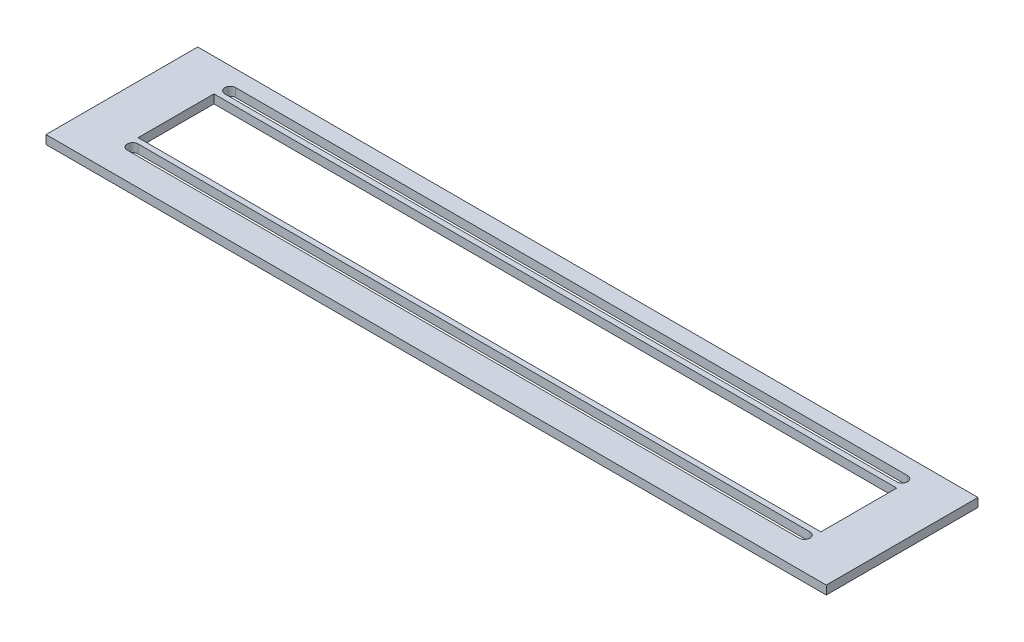
ISO-10303-21;
HEADER;
FILE_DESCRIPTION(('STEP AP214'),'2;1');
FILE_NAME('part.step','',(''),(''),'','','');
FILE_SCHEMA(('AUTOMOTIVE_DESIGN { 1 0 10303 214 1 1 1 1 }'));
ENDSEC;
DATA;
#1=APPLICATION_CONTEXT('core data for automotive mechanical design processes');
#2=APPLICATION_PROTOCOL_DEFINITION('international standard','automotive_design',2000,#1);
#3=PRODUCT_CONTEXT('',#1,'mechanical');
#4=PRODUCT('Part','Part','',(#3));
#5=PRODUCT_RELATED_PRODUCT_CATEGORY('part','',(#4));
#6=PRODUCT_DEFINITION_FORMATION('','',#4);
#7=PRODUCT_DEFINITION_CONTEXT('part definition',#1,'design');
#8=PRODUCT_DEFINITION('design','',#6,#7);
#9=PRODUCT_DEFINITION_SHAPE('','',#8);
#10=(LENGTH_UNIT() NAMED_UNIT(*) SI_UNIT(.MILLI.,.METRE.));
#11=(NAMED_UNIT(*) PLANE_ANGLE_UNIT() SI_UNIT($,.RADIAN.));
#12=(NAMED_UNIT(*) SI_UNIT($,.STERADIAN.) SOLID_ANGLE_UNIT());
#13=UNCERTAINTY_MEASURE_WITH_UNIT(LENGTH_MEASURE(1.E-05),#10,'distance_accuracy_value','');
#14=(GEOMETRIC_REPRESENTATION_CONTEXT(3) GLOBAL_UNCERTAINTY_ASSIGNED_CONTEXT((#13)) GLOBAL_UNIT_ASSIGNED_CONTEXT((#10,
#11,#12)) REPRESENTATION_CONTEXT('',''));
#15=CARTESIAN_POINT('',(0.,0.,0.));
#16=DIRECTION('',(0.,0.,1.));
#17=DIRECTION('',(1.,0.,0.));
#18=AXIS2_PLACEMENT_3D('',#15,#16,#17);
#19=CARTESIAN_POINT('',(360.,4.,0.));
#20=DIRECTION('',(0.,0.,1.));
#21=DIRECTION('',(1.,0.,0.));
#22=AXIS2_PLACEMENT_3D('',#19,#20,#21);
#23=PLANE('',#22);
#24=DIRECTION('',(-1.,0.,0.));
#25=VECTOR('',#24,1.);
#26=CARTESIAN_POINT('',(360.,0.,0.));
#27=LINE('',#26,#25);
#28=CARTESIAN_POINT('',(360.,0.,0.));
#29=VERTEX_POINT('',#28);
#30=CARTESIAN_POINT('',(0.,0.,0.));
#31=VERTEX_POINT('',#30);
#32=EDGE_CURVE('E268',#29,#31,#27,.T.);
#33=ORIENTED_EDGE('',*,*,#32,.T.);
#34=DIRECTION('',(0.,-1.,0.));
#35=VECTOR('',#34,1.);
#36=CARTESIAN_POINT('',(0.,4.,0.));
#37=LINE('',#36,#35);
#38=CARTESIAN_POINT('',(0.,4.,0.));
#39=VERTEX_POINT('',#38);
#40=EDGE_CURVE('E12',#39,#31,#37,.T.);
#41=ORIENTED_EDGE('',*,*,#40,.F.);
#42=DIRECTION('',(-1.,0.,0.));
#43=VECTOR('',#42,1.);
#44=CARTESIAN_POINT('',(360.,4.,0.));
#45=LINE('',#44,#43);
#46=CARTESIAN_POINT('',(360.,4.,0.));
#47=VERTEX_POINT('',#46);
#48=EDGE_CURVE('E275',#47,#39,#45,.T.);
#49=ORIENTED_EDGE('',*,*,#48,.F.);
#50=DIRECTION('',(0.,-1.,0.));
#51=VECTOR('',#50,1.);
#52=CARTESIAN_POINT('',(360.,4.,0.));
#53=LINE('',#52,#51);
#54=EDGE_CURVE('E285',#47,#29,#53,.T.);
#55=ORIENTED_EDGE('',*,*,#54,.T.);
#56=EDGE_LOOP('',(#33,#41,#49,#55));
#57=FACE_BOUND('',#56,.T.);
#58=ADVANCED_FACE('F63',(#57),#23,.F.);
#59=CARTESIAN_POINT('',(0.,4.,0.));
#60=DIRECTION('',(1.,0.,0.));
#61=DIRECTION('',(0.,0.,-1.));
#62=AXIS2_PLACEMENT_3D('',#59,#60,#61);
#63=PLANE('',#62);
#64=DIRECTION('',(0.,0.,1.));
#65=VECTOR('',#64,1.);
#66=CARTESIAN_POINT('',(0.,0.,0.));
#67=LINE('',#66,#65);
#68=CARTESIAN_POINT('',(0.,0.,70.));
#69=VERTEX_POINT('',#68);
#70=EDGE_CURVE('E288',#31,#69,#67,.T.);
#71=ORIENTED_EDGE('',*,*,#70,.T.);
#72=DIRECTION('',(0.,-1.,0.));
#73=VECTOR('',#72,1.);
#74=CARTESIAN_POINT('',(0.,4.,70.));
#75=LINE('',#74,#73);
#76=CARTESIAN_POINT('',(0.,4.,70.));
#77=VERTEX_POINT('',#76);
#78=EDGE_CURVE('E70',#77,#69,#75,.T.);
#79=ORIENTED_EDGE('',*,*,#78,.F.);
#80=DIRECTION('',(0.,0.,1.));
#81=VECTOR('',#80,1.);
#82=CARTESIAN_POINT('',(0.,4.,0.));
#83=LINE('',#82,#81);
#84=EDGE_CURVE('E278',#39,#77,#83,.T.);
#85=ORIENTED_EDGE('',*,*,#84,.F.);
#86=ORIENTED_EDGE('',*,*,#40,.T.);
#87=EDGE_LOOP('',(#71,#79,#85,#86));
#88=FACE_BOUND('',#87,.T.);
#89=ADVANCED_FACE('F317',(#88),#63,.F.);
#90=CARTESIAN_POINT('',(0.,4.,70.));
#91=DIRECTION('',(0.,0.,-1.));
#92=DIRECTION('',(-1.,0.,0.));
#93=AXIS2_PLACEMENT_3D('',#90,#91,#92);
#94=PLANE('',#93);
#95=DIRECTION('',(1.,0.,0.));
#96=VECTOR('',#95,1.);
#97=CARTESIAN_POINT('',(0.,0.,70.));
#98=LINE('',#97,#96);
#99=CARTESIAN_POINT('',(360.,0.,70.));
#100=VERTEX_POINT('',#99);
#101=EDGE_CURVE('E290',#69,#100,#98,.T.);
#102=ORIENTED_EDGE('',*,*,#101,.T.);
#103=DIRECTION('',(0.,-1.,0.));
#104=VECTOR('',#103,1.);
#105=CARTESIAN_POINT('',(360.,4.,70.));
#106=LINE('',#105,#104);
#107=CARTESIAN_POINT('',(360.,4.,70.));
#108=VERTEX_POINT('',#107);
#109=EDGE_CURVE('E295',#108,#100,#106,.T.);
#110=ORIENTED_EDGE('',*,*,#109,.F.);
#111=DIRECTION('',(1.,0.,0.));
#112=VECTOR('',#111,1.);
#113=CARTESIAN_POINT('',(0.,4.,70.));
#114=LINE('',#113,#112);
#115=EDGE_CURVE('E281',#77,#108,#114,.T.);
#116=ORIENTED_EDGE('',*,*,#115,.F.);
#117=ORIENTED_EDGE('',*,*,#78,.T.);
#118=EDGE_LOOP('',(#102,#110,#116,#117));
#119=FACE_BOUND('',#118,.T.);
#120=ADVANCED_FACE('F302',(#119),#94,.F.);
#121=CARTESIAN_POINT('',(360.,4.,70.));
#122=DIRECTION('',(-1.,0.,0.));
#123=DIRECTION('',(0.,0.,1.));
#124=AXIS2_PLACEMENT_3D('',#121,#122,#123);
#125=PLANE('',#124);
#126=DIRECTION('',(0.,0.,-1.));
#127=VECTOR('',#126,1.);
#128=CARTESIAN_POINT('',(360.,0.,70.));
#129=LINE('',#128,#127);
#130=EDGE_CURVE('E279',#100,#29,#129,.T.);
#131=ORIENTED_EDGE('',*,*,#130,.T.);
#132=ORIENTED_EDGE('',*,*,#54,.F.);
#133=DIRECTION('',(0.,0.,-1.));
#134=VECTOR('',#133,1.);
#135=CARTESIAN_POINT('',(360.,4.,70.));
#136=LINE('',#135,#134);
#137=EDGE_CURVE('E283',#108,#47,#136,.T.);
#138=ORIENTED_EDGE('',*,*,#137,.F.);
#139=ORIENTED_EDGE('',*,*,#109,.T.);
#140=EDGE_LOOP('',(#131,#132,#138,#139));
#141=FACE_BOUND('',#140,.T.);
#142=ADVANCED_FACE('F311',(#141),#125,.F.);
#143=CARTESIAN_POINT('',(0.,4.,0.));
#144=DIRECTION('',(0.,1.,0.));
#145=DIRECTION('',(0.,0.,1.));
#146=AXIS2_PLACEMENT_3D('',#143,#144,#145);
#147=PLANE('',#146);
#148=DIRECTION('',(1.,0.,0.));
#149=VECTOR('',#148,1.);
#150=CARTESIAN_POINT('',(0.,4.,15.));
#151=LINE('',#150,#149);
#152=CARTESIAN_POINT('',(22.5,4.,15.));
#153=VERTEX_POINT('',#152);
#154=CARTESIAN_POINT('',(337.5,4.,15.));
#155=VERTEX_POINT('',#154);
#156=EDGE_CURVE('E182',#153,#155,#151,.T.);
#157=ORIENTED_EDGE('',*,*,#156,.T.);
#158=DIRECTION('',(0.,0.,-1.));
#159=VECTOR('',#158,1.);
#160=CARTESIAN_POINT('',(337.5,4.,4.16333634234434E-13));
#161=LINE('',#160,#159);
#162=CARTESIAN_POINT('',(337.5,4.,50.));
#163=VERTEX_POINT('',#162);
#164=EDGE_CURVE('E174',#163,#155,#161,.T.);
#165=ORIENTED_EDGE('',*,*,#164,.F.);
#166=DIRECTION('',(1.,0.,0.));
#167=VECTOR('',#166,1.);
#168=CARTESIAN_POINT('',(0.,4.,50.));
#169=LINE('',#168,#167);
#170=CARTESIAN_POINT('',(22.5000000000001,4.,50.));
#171=VERTEX_POINT('',#170);
#172=EDGE_CURVE('E181',#171,#163,#169,.T.);
#173=ORIENTED_EDGE('',*,*,#172,.F.);
#174=DIRECTION('',(0.,0.,-1.));
#175=VECTOR('',#174,1.);
#176=CARTESIAN_POINT('',(22.5,4.,0.));
#177=LINE('',#176,#175);
#178=EDGE_CURVE('E187',#171,#153,#177,.T.);
#179=ORIENTED_EDGE('',*,*,#178,.T.);
#180=EDGE_LOOP('',(#157,#165,#173,#179));
#181=FACE_BOUND('',#180,.T.);
#182=CARTESIAN_POINT('',(335.,4.,10.));
#183=DIRECTION('',(0.,-1.,0.));
#184=DIRECTION('',(0.,0.,-1.));
#185=AXIS2_PLACEMENT_3D('',#182,#183,#184);
#186=CIRCLE('',#185,2.5);
#187=CARTESIAN_POINT('',(335.,4.,7.5));
#188=VERTEX_POINT('',#187);
#189=CARTESIAN_POINT('',(335.,4.,12.5));
#190=VERTEX_POINT('',#189);
#191=EDGE_CURVE('E211',#188,#190,#186,.T.);
#192=ORIENTED_EDGE('',*,*,#191,.T.);
#193=DIRECTION('',(1.,0.,0.));
#194=VECTOR('',#193,1.);
#195=CARTESIAN_POINT('',(0.,4.,12.5));
#196=LINE('',#195,#194);
#197=CARTESIAN_POINT('',(25.0000000000001,4.,12.5));
#198=VERTEX_POINT('',#197);
#199=EDGE_CURVE('E214',#198,#190,#196,.T.);
#200=ORIENTED_EDGE('',*,*,#199,.F.);
#201=CARTESIAN_POINT('',(25.,4.,10.));
#202=DIRECTION('',(0.,-1.,0.));
#203=DIRECTION('',(0.,0.,-1.));
#204=AXIS2_PLACEMENT_3D('',#201,#202,#203);
#205=CIRCLE('',#204,2.5);
#206=CARTESIAN_POINT('',(25.,4.,7.5));
#207=VERTEX_POINT('',#206);
#208=EDGE_CURVE('E229',#198,#207,#205,.T.);
#209=ORIENTED_EDGE('',*,*,#208,.T.);
#210=DIRECTION('',(1.,0.,0.));
#211=VECTOR('',#210,1.);
#212=CARTESIAN_POINT('',(25.,4.,7.5));
#213=LINE('',#212,#211);
#214=EDGE_CURVE('E232',#207,#188,#213,.T.);
#215=ORIENTED_EDGE('',*,*,#214,.T.);
#216=EDGE_LOOP('',(#192,#200,#209,#215));
#217=FACE_BOUND('',#216,.T.);
#218=DIRECTION('',(-1.,0.,0.));
#219=VECTOR('',#218,1.);
#220=CARTESIAN_POINT('',(0.,4.,52.5000000000001));
#221=LINE('',#220,#219);
#222=CARTESIAN_POINT('',(335.,4.,52.5));
#223=VERTEX_POINT('',#222);
#224=CARTESIAN_POINT('',(25.,4.,52.5));
#225=VERTEX_POINT('',#224);
#226=EDGE_CURVE('E227',#223,#225,#221,.T.);
#227=ORIENTED_EDGE('',*,*,#226,.F.);
#228=CARTESIAN_POINT('',(335.,4.,55.));
#229=DIRECTION('',(0.,1.,0.));
#230=DIRECTION('',(0.,0.,1.));
#231=AXIS2_PLACEMENT_3D('',#228,#229,#230);
#232=CIRCLE('',#231,2.49999999999996);
#233=CARTESIAN_POINT('',(335.,4.,57.5));
#234=VERTEX_POINT('',#233);
#235=EDGE_CURVE('E247',#234,#223,#232,.T.);
#236=ORIENTED_EDGE('',*,*,#235,.F.);
#237=DIRECTION('',(-1.,0.,0.));
#238=VECTOR('',#237,1.);
#239=CARTESIAN_POINT('',(0.,4.,57.5));
#240=LINE('',#239,#238);
#241=CARTESIAN_POINT('',(25.,4.,57.5));
#242=VERTEX_POINT('',#241);
#243=EDGE_CURVE('E261',#234,#242,#240,.T.);
#244=ORIENTED_EDGE('',*,*,#243,.T.);
#245=CARTESIAN_POINT('',(25.,4.,55.));
#246=DIRECTION('',(0.,1.,0.));
#247=DIRECTION('',(0.,0.,1.));
#248=AXIS2_PLACEMENT_3D('',#245,#246,#247);
#249=CIRCLE('',#248,2.49999999999996);
#250=EDGE_CURVE('E258',#225,#242,#249,.T.);
#251=ORIENTED_EDGE('',*,*,#250,.F.);
#252=EDGE_LOOP('',(#227,#236,#244,#251));
#253=FACE_BOUND('',#252,.T.);
#254=ORIENTED_EDGE('',*,*,#48,.T.);
#255=ORIENTED_EDGE('',*,*,#84,.T.);
#256=ORIENTED_EDGE('',*,*,#115,.T.);
#257=ORIENTED_EDGE('',*,*,#137,.T.);
#258=EDGE_LOOP('',(#254,#255,#256,#257));
#259=FACE_BOUND('',#258,.T.);
#260=ADVANCED_FACE('F189',(#181,#217,#253,#259),#147,.T.);
#261=CARTESIAN_POINT('',(0.,0.,0.));
#262=DIRECTION('',(0.,1.,0.));
#263=DIRECTION('',(0.,0.,1.));
#264=AXIS2_PLACEMENT_3D('',#261,#262,#263);
#265=PLANE('',#264);
#266=DIRECTION('',(0.,0.,-1.));
#267=VECTOR('',#266,1.);
#268=CARTESIAN_POINT('',(337.5,0.,4.16333634234434E-13));
#269=LINE('',#268,#267);
#270=CARTESIAN_POINT('',(337.5,0.,50.));
#271=VERTEX_POINT('',#270);
#272=CARTESIAN_POINT('',(337.5,0.,15.));
#273=VERTEX_POINT('',#272);
#274=EDGE_CURVE('E201',#271,#273,#269,.T.);
#275=ORIENTED_EDGE('',*,*,#274,.T.);
#276=DIRECTION('',(1.,0.,0.));
#277=VECTOR('',#276,1.);
#278=CARTESIAN_POINT('',(0.,0.,15.));
#279=LINE('',#278,#277);
#280=CARTESIAN_POINT('',(22.5,0.,15.));
#281=VERTEX_POINT('',#280);
#282=EDGE_CURVE('E85',#281,#273,#279,.T.);
#283=ORIENTED_EDGE('',*,*,#282,.F.);
#284=DIRECTION('',(0.,0.,-1.));
#285=VECTOR('',#284,1.);
#286=CARTESIAN_POINT('',(22.5,0.,0.));
#287=LINE('',#286,#285);
#288=CARTESIAN_POINT('',(22.5000000000001,0.,50.));
#289=VERTEX_POINT('',#288);
#290=EDGE_CURVE('E192',#289,#281,#287,.T.);
#291=ORIENTED_EDGE('',*,*,#290,.F.);
#292=DIRECTION('',(1.,0.,0.));
#293=VECTOR('',#292,1.);
#294=CARTESIAN_POINT('',(0.,0.,50.));
#295=LINE('',#294,#293);
#296=EDGE_CURVE('E195',#289,#271,#295,.T.);
#297=ORIENTED_EDGE('',*,*,#296,.T.);
#298=EDGE_LOOP('',(#275,#283,#291,#297));
#299=FACE_BOUND('',#298,.T.);
#300=DIRECTION('',(1.,0.,0.));
#301=VECTOR('',#300,1.);
#302=CARTESIAN_POINT('',(0.,0.,12.5));
#303=LINE('',#302,#301);
#304=CARTESIAN_POINT('',(25.,0.,12.5));
#305=VERTEX_POINT('',#304);
#306=CARTESIAN_POINT('',(335.,0.,12.5));
#307=VERTEX_POINT('',#306);
#308=EDGE_CURVE('E215',#305,#307,#303,.T.);
#309=ORIENTED_EDGE('',*,*,#308,.T.);
#310=CARTESIAN_POINT('',(335.,0.,10.));
#311=DIRECTION('',(0.,-1.,0.));
#312=DIRECTION('',(0.,0.,-1.));
#313=AXIS2_PLACEMENT_3D('',#310,#311,#312);
#314=CIRCLE('',#313,2.5);
#315=CARTESIAN_POINT('',(335.,0.,7.5));
#316=VERTEX_POINT('',#315);
#317=EDGE_CURVE('E218',#316,#307,#314,.T.);
#318=ORIENTED_EDGE('',*,*,#317,.F.);
#319=DIRECTION('',(1.,0.,0.));
#320=VECTOR('',#319,1.);
#321=CARTESIAN_POINT('',(25.,0.,7.5));
#322=LINE('',#321,#320);
#323=CARTESIAN_POINT('',(25.,0.,7.5));
#324=VERTEX_POINT('',#323);
#325=EDGE_CURVE('E233',#324,#316,#322,.T.);
#326=ORIENTED_EDGE('',*,*,#325,.F.);
#327=CARTESIAN_POINT('',(25.,0.,10.));
#328=DIRECTION('',(0.,-1.,0.));
#329=DIRECTION('',(0.,0.,-1.));
#330=AXIS2_PLACEMENT_3D('',#327,#328,#329);
#331=CIRCLE('',#330,2.5);
#332=EDGE_CURVE('E207',#305,#324,#331,.T.);
#333=ORIENTED_EDGE('',*,*,#332,.F.);
#334=EDGE_LOOP('',(#309,#318,#326,#333));
#335=FACE_BOUND('',#334,.T.);
#336=CARTESIAN_POINT('',(335.,0.,55.));
#337=DIRECTION('',(0.,1.,0.));
#338=DIRECTION('',(0.,0.,1.));
#339=AXIS2_PLACEMENT_3D('',#336,#337,#338);
#340=CIRCLE('',#339,2.49999999999996);
#341=CARTESIAN_POINT('',(335.,0.,57.5));
#342=VERTEX_POINT('',#341);
#343=CARTESIAN_POINT('',(335.,0.,52.5));
#344=VERTEX_POINT('',#343);
#345=EDGE_CURVE('E253',#342,#344,#340,.T.);
#346=ORIENTED_EDGE('',*,*,#345,.T.);
#347=DIRECTION('',(-1.,0.,0.));
#348=VECTOR('',#347,1.);
#349=CARTESIAN_POINT('',(0.,0.,52.5000000000001));
#350=LINE('',#349,#348);
#351=CARTESIAN_POINT('',(25.,0.,52.5000000000001));
#352=VERTEX_POINT('',#351);
#353=EDGE_CURVE('E243',#344,#352,#350,.T.);
#354=ORIENTED_EDGE('',*,*,#353,.T.);
#355=CARTESIAN_POINT('',(25.,0.,55.));
#356=DIRECTION('',(0.,1.,0.));
#357=DIRECTION('',(0.,0.,1.));
#358=AXIS2_PLACEMENT_3D('',#355,#356,#357);
#359=CIRCLE('',#358,2.49999999999996);
#360=CARTESIAN_POINT('',(25.,0.,57.5));
#361=VERTEX_POINT('',#360);
#362=EDGE_CURVE('E246',#352,#361,#359,.T.);
#363=ORIENTED_EDGE('',*,*,#362,.T.);
#364=DIRECTION('',(-1.,0.,0.));
#365=VECTOR('',#364,1.);
#366=CARTESIAN_POINT('',(0.,0.,57.5));
#367=LINE('',#366,#365);
#368=EDGE_CURVE('E250',#342,#361,#367,.T.);
#369=ORIENTED_EDGE('',*,*,#368,.F.);
#370=EDGE_LOOP('',(#346,#354,#363,#369));
#371=FACE_BOUND('',#370,.T.);
#372=ORIENTED_EDGE('',*,*,#32,.F.);
#373=ORIENTED_EDGE('',*,*,#130,.F.);
#374=ORIENTED_EDGE('',*,*,#101,.F.);
#375=ORIENTED_EDGE('',*,*,#70,.F.);
#376=EDGE_LOOP('',(#372,#373,#374,#375));
#377=FACE_BOUND('',#376,.T.);
#378=ADVANCED_FACE('F308',(#299,#335,#371,#377),#265,.F.);
#379=CARTESIAN_POINT('',(0.,0.,52.5000000000001));
#380=DIRECTION('',(0.,0.,-1.));
#381=DIRECTION('',(-1.,0.,0.));
#382=AXIS2_PLACEMENT_3D('',#379,#380,#381);
#383=PLANE('',#382);
#384=ORIENTED_EDGE('',*,*,#226,.T.);
#385=DIRECTION('',(0.,1.,0.));
#386=VECTOR('',#385,1.);
#387=CARTESIAN_POINT('',(25.,0.,52.5000000000001));
#388=LINE('',#387,#386);
#389=EDGE_CURVE('E256',#352,#225,#388,.T.);
#390=ORIENTED_EDGE('',*,*,#389,.F.);
#391=ORIENTED_EDGE('',*,*,#353,.F.);
#392=DIRECTION('',(0.,1.,0.));
#393=VECTOR('',#392,1.);
#394=CARTESIAN_POINT('',(335.,0.,52.5));
#395=LINE('',#394,#393);
#396=EDGE_CURVE('E266',#344,#223,#395,.T.);
#397=ORIENTED_EDGE('',*,*,#396,.T.);
#398=EDGE_LOOP('',(#384,#390,#391,#397));
#399=FACE_BOUND('',#398,.T.);
#400=ADVANCED_FACE('F329',(#399),#383,.F.);
#401=CARTESIAN_POINT('',(335.,0.,55.));
#402=DIRECTION('',(0.,1.,0.));
#403=DIRECTION('',(0.,0.,1.));
#404=AXIS2_PLACEMENT_3D('',#401,#402,#403);
#405=CYLINDRICAL_SURFACE('',#404,2.49999999999996);
#406=ORIENTED_EDGE('',*,*,#235,.T.);
#407=ORIENTED_EDGE('',*,*,#396,.F.);
#408=ORIENTED_EDGE('',*,*,#345,.F.);
#409=DIRECTION('',(0.,1.,0.));
#410=VECTOR('',#409,1.);
#411=CARTESIAN_POINT('',(335.,0.,57.5));
#412=LINE('',#411,#410);
#413=EDGE_CURVE('E269',#342,#234,#412,.T.);
#414=ORIENTED_EDGE('',*,*,#413,.T.);
#415=EDGE_LOOP('',(#406,#407,#408,#414));
#416=FACE_BOUND('',#415,.T.);
#417=ADVANCED_FACE('F335',(#416),#405,.F.);
#418=CARTESIAN_POINT('',(0.,0.,57.5));
#419=DIRECTION('',(0.,0.,-1.));
#420=DIRECTION('',(-1.,0.,0.));
#421=AXIS2_PLACEMENT_3D('',#418,#419,#420);
#422=PLANE('',#421);
#423=ORIENTED_EDGE('',*,*,#243,.F.);
#424=ORIENTED_EDGE('',*,*,#413,.F.);
#425=ORIENTED_EDGE('',*,*,#368,.T.);
#426=DIRECTION('',(0.,1.,0.));
#427=VECTOR('',#426,1.);
#428=CARTESIAN_POINT('',(25.,0.,57.5));
#429=LINE('',#428,#427);
#430=EDGE_CURVE('E271',#361,#242,#429,.T.);
#431=ORIENTED_EDGE('',*,*,#430,.T.);
#432=EDGE_LOOP('',(#423,#424,#425,#431));
#433=FACE_BOUND('',#432,.T.);
#434=ADVANCED_FACE('F341',(#433),#422,.T.);
#435=CARTESIAN_POINT('',(25.,0.,55.));
#436=DIRECTION('',(0.,1.,0.));
#437=DIRECTION('',(0.,0.,1.));
#438=AXIS2_PLACEMENT_3D('',#435,#436,#437);
#439=CYLINDRICAL_SURFACE('',#438,2.49999999999996);
#440=ORIENTED_EDGE('',*,*,#250,.T.);
#441=ORIENTED_EDGE('',*,*,#430,.F.);
#442=ORIENTED_EDGE('',*,*,#362,.F.);
#443=ORIENTED_EDGE('',*,*,#389,.T.);
#444=EDGE_LOOP('',(#440,#441,#442,#443));
#445=FACE_BOUND('',#444,.T.);
#446=ADVANCED_FACE('F337',(#445),#439,.F.);
#447=CARTESIAN_POINT('',(335.,4.,10.));
#448=DIRECTION('',(0.,-1.,0.));
#449=DIRECTION('',(0.,0.,-1.));
#450=AXIS2_PLACEMENT_3D('',#447,#448,#449);
#451=CYLINDRICAL_SURFACE('',#450,2.5);
#452=ORIENTED_EDGE('',*,*,#317,.T.);
#453=DIRECTION('',(0.,-1.,0.));
#454=VECTOR('',#453,1.);
#455=CARTESIAN_POINT('',(335.,4.,12.5));
#456=LINE('',#455,#454);
#457=EDGE_CURVE('E217',#190,#307,#456,.T.);
#458=ORIENTED_EDGE('',*,*,#457,.F.);
#459=ORIENTED_EDGE('',*,*,#191,.F.);
#460=DIRECTION('',(0.,-1.,0.));
#461=VECTOR('',#460,1.);
#462=CARTESIAN_POINT('',(335.,4.,7.5));
#463=LINE('',#462,#461);
#464=EDGE_CURVE('E221',#188,#316,#463,.T.);
#465=ORIENTED_EDGE('',*,*,#464,.T.);
#466=EDGE_LOOP('',(#452,#458,#459,#465));
#467=FACE_BOUND('',#466,.T.);
#468=ADVANCED_FACE('F340',(#467),#451,.F.);
#469=CARTESIAN_POINT('',(0.,4.,12.5));
#470=DIRECTION('',(0.,0.,-1.));
#471=DIRECTION('',(-1.,0.,0.));
#472=AXIS2_PLACEMENT_3D('',#469,#470,#471);
#473=PLANE('',#472);
#474=ORIENTED_EDGE('',*,*,#308,.F.);
#475=DIRECTION('',(0.,-1.,0.));
#476=VECTOR('',#475,1.);
#477=CARTESIAN_POINT('',(25.0000000000001,4.,12.5));
#478=LINE('',#477,#476);
#479=EDGE_CURVE('E224',#198,#305,#478,.T.);
#480=ORIENTED_EDGE('',*,*,#479,.F.);
#481=ORIENTED_EDGE('',*,*,#199,.T.);
#482=ORIENTED_EDGE('',*,*,#457,.T.);
#483=EDGE_LOOP('',(#474,#480,#481,#482));
#484=FACE_BOUND('',#483,.T.);
#485=ADVANCED_FACE('F356',(#484),#473,.T.);
#486=CARTESIAN_POINT('',(25.,4.,7.5));
#487=DIRECTION('',(0.,0.,-1.));
#488=DIRECTION('',(-1.,0.,0.));
#489=AXIS2_PLACEMENT_3D('',#486,#487,#488);
#490=PLANE('',#489);
#491=ORIENTED_EDGE('',*,*,#325,.T.);
#492=ORIENTED_EDGE('',*,*,#464,.F.);
#493=ORIENTED_EDGE('',*,*,#214,.F.);
#494=DIRECTION('',(0.,-1.,0.));
#495=VECTOR('',#494,1.);
#496=CARTESIAN_POINT('',(25.,4.,7.5));
#497=LINE('',#496,#495);
#498=EDGE_CURVE('E236',#207,#324,#497,.T.);
#499=ORIENTED_EDGE('',*,*,#498,.T.);
#500=EDGE_LOOP('',(#491,#492,#493,#499));
#501=FACE_BOUND('',#500,.T.);
#502=ADVANCED_FACE('F352',(#501),#490,.F.);
#503=CARTESIAN_POINT('',(25.,4.,10.));
#504=DIRECTION('',(0.,-1.,0.));
#505=DIRECTION('',(0.,0.,-1.));
#506=AXIS2_PLACEMENT_3D('',#503,#504,#505);
#507=CYLINDRICAL_SURFACE('',#506,2.5);
#508=ORIENTED_EDGE('',*,*,#332,.T.);
#509=ORIENTED_EDGE('',*,*,#498,.F.);
#510=ORIENTED_EDGE('',*,*,#208,.F.);
#511=ORIENTED_EDGE('',*,*,#479,.T.);
#512=EDGE_LOOP('',(#508,#509,#510,#511));
#513=FACE_BOUND('',#512,.T.);
#514=ADVANCED_FACE('F349',(#513),#507,.F.);
#515=CARTESIAN_POINT('',(0.,4.,15.));
#516=DIRECTION('',(0.,0.,-1.));
#517=DIRECTION('',(-1.,0.,0.));
#518=AXIS2_PLACEMENT_3D('',#515,#516,#517);
#519=PLANE('',#518);
#520=ORIENTED_EDGE('',*,*,#282,.T.);
#521=DIRECTION('',(0.,-1.,0.));
#522=VECTOR('',#521,1.);
#523=CARTESIAN_POINT('',(337.5,4.,15.));
#524=LINE('',#523,#522);
#525=EDGE_CURVE('E176',#155,#273,#524,.T.);
#526=ORIENTED_EDGE('',*,*,#525,.F.);
#527=ORIENTED_EDGE('',*,*,#156,.F.);
#528=DIRECTION('',(0.,-1.,0.));
#529=VECTOR('',#528,1.);
#530=CARTESIAN_POINT('',(22.5,4.,15.));
#531=LINE('',#530,#529);
#532=EDGE_CURVE('E205',#153,#281,#531,.T.);
#533=ORIENTED_EDGE('',*,*,#532,.T.);
#534=EDGE_LOOP('',(#520,#526,#527,#533));
#535=FACE_BOUND('',#534,.T.);
#536=ADVANCED_FACE('F185',(#535),#519,.F.);
#537=CARTESIAN_POINT('',(22.5,4.,0.));
#538=DIRECTION('',(-1.,0.,0.));
#539=DIRECTION('',(0.,0.,1.));
#540=AXIS2_PLACEMENT_3D('',#537,#538,#539);
#541=PLANE('',#540);
#542=ORIENTED_EDGE('',*,*,#290,.T.);
#543=ORIENTED_EDGE('',*,*,#532,.F.);
#544=ORIENTED_EDGE('',*,*,#178,.F.);
#545=DIRECTION('',(0.,-1.,0.));
#546=VECTOR('',#545,1.);
#547=CARTESIAN_POINT('',(22.5000000000001,4.,50.));
#548=LINE('',#547,#546);
#549=EDGE_CURVE('E208',#171,#289,#548,.T.);
#550=ORIENTED_EDGE('',*,*,#549,.T.);
#551=EDGE_LOOP('',(#542,#543,#544,#550));
#552=FACE_BOUND('',#551,.T.);
#553=ADVANCED_FACE('F366',(#552),#541,.F.);
#554=CARTESIAN_POINT('',(0.,4.,50.));
#555=DIRECTION('',(0.,0.,-1.));
#556=DIRECTION('',(-1.,0.,0.));
#557=AXIS2_PLACEMENT_3D('',#554,#555,#556);
#558=PLANE('',#557);
#559=ORIENTED_EDGE('',*,*,#296,.F.);
#560=ORIENTED_EDGE('',*,*,#549,.F.);
#561=ORIENTED_EDGE('',*,*,#172,.T.);
#562=DIRECTION('',(0.,-1.,0.));
#563=VECTOR('',#562,1.);
#564=CARTESIAN_POINT('',(337.5,4.,50.));
#565=LINE('',#564,#563);
#566=EDGE_CURVE('E77',#163,#271,#565,.T.);
#567=ORIENTED_EDGE('',*,*,#566,.T.);
#568=EDGE_LOOP('',(#559,#560,#561,#567));
#569=FACE_BOUND('',#568,.T.);
#570=ADVANCED_FACE('F369',(#569),#558,.T.);
#571=CARTESIAN_POINT('',(337.5,4.,4.16333634234434E-13));
#572=DIRECTION('',(-1.,0.,0.));
#573=DIRECTION('',(0.,0.,1.));
#574=AXIS2_PLACEMENT_3D('',#571,#572,#573);
#575=PLANE('',#574);
#576=ORIENTED_EDGE('',*,*,#274,.F.);
#577=ORIENTED_EDGE('',*,*,#566,.F.);
#578=ORIENTED_EDGE('',*,*,#164,.T.);
#579=ORIENTED_EDGE('',*,*,#525,.T.);
#580=EDGE_LOOP('',(#576,#577,#578,#579));
#581=FACE_BOUND('',#580,.T.);
#582=ADVANCED_FACE('F175',(#581),#575,.T.);
#583=CLOSED_SHELL('',(#58,#89,#120,#142,#260,#378,#400,#417,#434,#446,#468,#485,#502,#514,#536,
#553,#570,#582));
#584=MANIFOLD_SOLID_BREP('B2',#583);
#585=ADVANCED_BREP_SHAPE_REPRESENTATION('',(#18,#584),#14);
#586=SHAPE_DEFINITION_REPRESENTATION(#9,#585);
ENDSEC;
END-ISO-10303-21;
